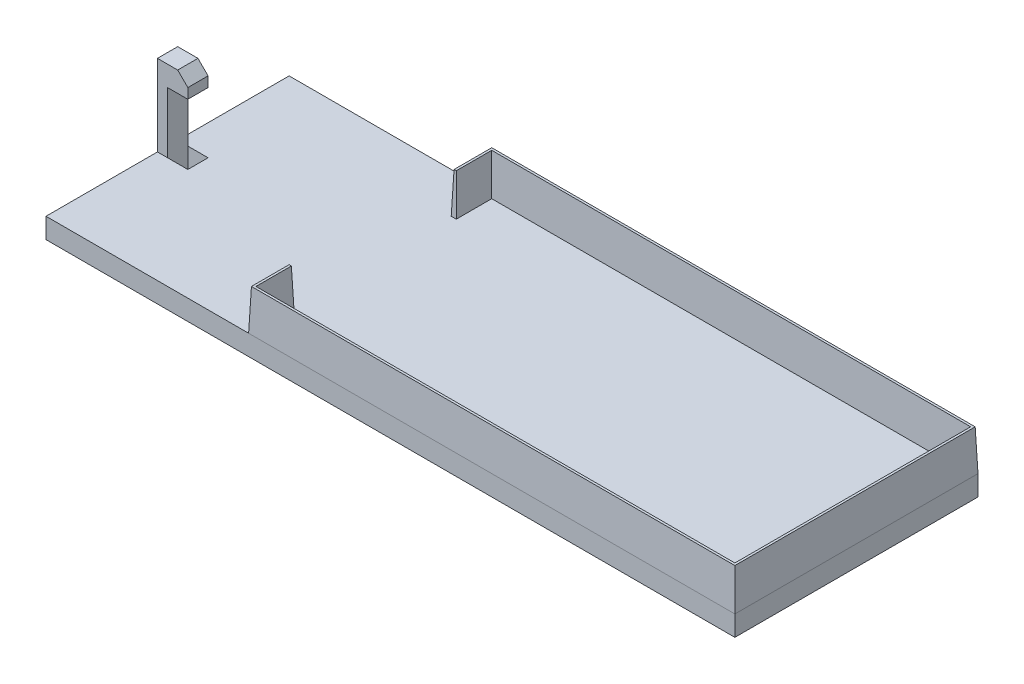
ISO-10303-21;
HEADER;
FILE_DESCRIPTION(('STEP AP214'),'2;1');
FILE_NAME('part.step','',(''),(''),'','','');
FILE_SCHEMA(('AUTOMOTIVE_DESIGN { 1 0 10303 214 1 1 1 1 }'));
ENDSEC;
DATA;
#1=APPLICATION_CONTEXT('core data for automotive mechanical design processes');
#2=APPLICATION_PROTOCOL_DEFINITION('international standard','automotive_design',2000,#1);
#3=PRODUCT_CONTEXT('',#1,'mechanical');
#4=PRODUCT('Part','Part','',(#3));
#5=PRODUCT_RELATED_PRODUCT_CATEGORY('part','',(#4));
#6=PRODUCT_DEFINITION_FORMATION('','',#4);
#7=PRODUCT_DEFINITION_CONTEXT('part definition',#1,'design');
#8=PRODUCT_DEFINITION('design','',#6,#7);
#9=PRODUCT_DEFINITION_SHAPE('','',#8);
#10=(LENGTH_UNIT() NAMED_UNIT(*) SI_UNIT(.MILLI.,.METRE.));
#11=(NAMED_UNIT(*) PLANE_ANGLE_UNIT() SI_UNIT($,.RADIAN.));
#12=(NAMED_UNIT(*) SI_UNIT($,.STERADIAN.) SOLID_ANGLE_UNIT());
#13=UNCERTAINTY_MEASURE_WITH_UNIT(LENGTH_MEASURE(1.E-05),#10,'distance_accuracy_value','');
#14=(GEOMETRIC_REPRESENTATION_CONTEXT(3) GLOBAL_UNCERTAINTY_ASSIGNED_CONTEXT((#13)) GLOBAL_UNIT_ASSIGNED_CONTEXT((#10,
#11,#12)) REPRESENTATION_CONTEXT('',''));
#15=CARTESIAN_POINT('',(0.,0.,0.));
#16=DIRECTION('',(0.,0.,1.));
#17=DIRECTION('',(1.,0.,0.));
#18=AXIS2_PLACEMENT_3D('',#15,#16,#17);
#19=CARTESIAN_POINT('',(0.,6.35,0.));
#20=DIRECTION('',(0.,-1.,0.));
#21=DIRECTION('',(0.,0.,-1.));
#22=AXIS2_PLACEMENT_3D('',#19,#20,#21);
#23=PLANE('',#22);
#24=DIRECTION('',(1.,0.,0.));
#25=VECTOR('',#24,1.);
#26=CARTESIAN_POINT('',(-104.775,6.35,-3.175));
#27=LINE('',#26,#25);
#28=CARTESIAN_POINT('',(-107.95,6.35,-3.17499999999998));
#29=VERTEX_POINT('',#28);
#30=CARTESIAN_POINT('',(-104.775,6.35,-3.175));
#31=VERTEX_POINT('',#30);
#32=EDGE_CURVE('E235',#29,#31,#27,.T.);
#33=ORIENTED_EDGE('',*,*,#32,.T.);
#34=DIRECTION('',(-1.,0.,0.));
#35=VECTOR('',#34,1.);
#36=CARTESIAN_POINT('',(-98.425,6.35,-3.175));
#37=LINE('',#36,#35);
#38=CARTESIAN_POINT('',(-98.425,6.35,-3.175));
#39=VERTEX_POINT('',#38);
#40=EDGE_CURVE('E56',#39,#31,#37,.T.);
#41=ORIENTED_EDGE('',*,*,#40,.F.);
#42=DIRECTION('',(0.,0.,-1.));
#43=VECTOR('',#42,1.);
#44=CARTESIAN_POINT('',(-98.425,6.35,3.175));
#45=LINE('',#44,#43);
#46=CARTESIAN_POINT('',(-98.425,6.35,3.175));
#47=VERTEX_POINT('',#46);
#48=EDGE_CURVE('E224',#47,#39,#45,.T.);
#49=ORIENTED_EDGE('',*,*,#48,.F.);
#50=DIRECTION('',(1.,0.,0.));
#51=VECTOR('',#50,1.);
#52=CARTESIAN_POINT('',(-104.775,6.35,3.175));
#53=LINE('',#52,#51);
#54=CARTESIAN_POINT('',(-104.775,6.35,3.175));
#55=VERTEX_POINT('',#54);
#56=EDGE_CURVE('E229',#55,#47,#53,.T.);
#57=ORIENTED_EDGE('',*,*,#56,.F.);
#58=DIRECTION('',(1.,0.,0.));
#59=VECTOR('',#58,1.);
#60=CARTESIAN_POINT('',(-104.775,6.35,3.175));
#61=LINE('',#60,#59);
#62=CARTESIAN_POINT('',(-107.95,6.35,3.175));
#63=VERTEX_POINT('',#62);
#64=EDGE_CURVE('E239',#63,#55,#61,.T.);
#65=ORIENTED_EDGE('',*,*,#64,.F.);
#66=DIRECTION('',(0.,0.,1.));
#67=VECTOR('',#66,1.);
#68=CARTESIAN_POINT('',(-107.95,6.35,38.1));
#69=LINE('',#68,#67);
#70=CARTESIAN_POINT('',(-107.95,6.35,38.1));
#71=VERTEX_POINT('',#70);
#72=EDGE_CURVE('E383',#63,#71,#69,.T.);
#73=ORIENTED_EDGE('',*,*,#72,.T.);
#74=DIRECTION('',(1.,0.,0.));
#75=VECTOR('',#74,1.);
#76=CARTESIAN_POINT('',(-107.95,6.35,38.1));
#77=LINE('',#76,#75);
#78=CARTESIAN_POINT('',(-44.45,6.35,38.1));
#79=VERTEX_POINT('',#78);
#80=EDGE_CURVE('E386',#71,#79,#77,.T.);
#81=ORIENTED_EDGE('',*,*,#80,.T.);
#82=DIRECTION('',(0.,0.,1.));
#83=VECTOR('',#82,1.);
#84=CARTESIAN_POINT('',(-44.45,6.35,25.4));
#85=LINE('',#84,#83);
#86=CARTESIAN_POINT('',(-44.45,6.35,25.4));
#87=VERTEX_POINT('',#86);
#88=EDGE_CURVE('E283',#87,#79,#85,.T.);
#89=ORIENTED_EDGE('',*,*,#88,.F.);
#90=DIRECTION('',(-1.,0.,0.));
#91=VECTOR('',#90,1.);
#92=CARTESIAN_POINT('',(-44.45,6.35,25.4));
#93=LINE('',#92,#91);
#94=CARTESIAN_POINT('',(-42.8625,6.35,25.4));
#95=VERTEX_POINT('',#94);
#96=EDGE_CURVE('E310',#95,#87,#93,.T.);
#97=ORIENTED_EDGE('',*,*,#96,.F.);
#98=DIRECTION('',(0.,0.,-1.));
#99=VECTOR('',#98,1.);
#100=CARTESIAN_POINT('',(-42.8625,6.35,25.4));
#101=LINE('',#100,#99);
#102=CARTESIAN_POINT('',(-42.8625,6.35,36.5125));
#103=VERTEX_POINT('',#102);
#104=EDGE_CURVE('E307',#103,#95,#101,.T.);
#105=ORIENTED_EDGE('',*,*,#104,.F.);
#106=DIRECTION('',(-1.,0.,0.));
#107=VECTOR('',#106,1.);
#108=CARTESIAN_POINT('',(-42.8625,6.35,36.5125));
#109=LINE('',#108,#107);
#110=CARTESIAN_POINT('',(106.3625,6.35,36.5125));
#111=VERTEX_POINT('',#110);
#112=EDGE_CURVE('E304',#111,#103,#109,.T.);
#113=ORIENTED_EDGE('',*,*,#112,.F.);
#114=DIRECTION('',(0.,0.,1.));
#115=VECTOR('',#114,1.);
#116=CARTESIAN_POINT('',(106.3625,6.35,36.5125));
#117=LINE('',#116,#115);
#118=CARTESIAN_POINT('',(106.3625,6.35,-36.5125));
#119=VERTEX_POINT('',#118);
#120=EDGE_CURVE('E301',#119,#111,#117,.T.);
#121=ORIENTED_EDGE('',*,*,#120,.F.);
#122=DIRECTION('',(1.,0.,0.));
#123=VECTOR('',#122,1.);
#124=CARTESIAN_POINT('',(106.3625,6.35,-36.5125));
#125=LINE('',#124,#123);
#126=CARTESIAN_POINT('',(-42.8625000000001,6.35,-36.5125));
#127=VERTEX_POINT('',#126);
#128=EDGE_CURVE('E298',#127,#119,#125,.T.);
#129=ORIENTED_EDGE('',*,*,#128,.F.);
#130=DIRECTION('',(0.,0.,-1.));
#131=VECTOR('',#130,1.);
#132=CARTESIAN_POINT('',(-42.8625000000001,6.35,-36.5125));
#133=LINE('',#132,#131);
#134=CARTESIAN_POINT('',(-42.8625000000001,6.35,-25.4));
#135=VERTEX_POINT('',#134);
#136=EDGE_CURVE('E295',#135,#127,#133,.T.);
#137=ORIENTED_EDGE('',*,*,#136,.F.);
#138=DIRECTION('',(1.,0.,0.));
#139=VECTOR('',#138,1.);
#140=CARTESIAN_POINT('',(-44.4500000000001,6.35,-25.4));
#141=LINE('',#140,#139);
#142=CARTESIAN_POINT('',(-44.4500000000001,6.35,-25.4));
#143=VERTEX_POINT('',#142);
#144=EDGE_CURVE('E292',#143,#135,#141,.T.);
#145=ORIENTED_EDGE('',*,*,#144,.F.);
#146=DIRECTION('',(0.,0.,1.));
#147=VECTOR('',#146,1.);
#148=CARTESIAN_POINT('',(-44.4500000000001,6.35,-38.1));
#149=LINE('',#148,#147);
#150=CARTESIAN_POINT('',(-44.4500000000001,6.35,-38.1));
#151=VERTEX_POINT('',#150);
#152=EDGE_CURVE('E289',#151,#143,#149,.T.);
#153=ORIENTED_EDGE('',*,*,#152,.F.);
#154=DIRECTION('',(-1.,0.,0.));
#155=VECTOR('',#154,1.);
#156=CARTESIAN_POINT('',(-107.95,6.35,-38.1));
#157=LINE('',#156,#155);
#158=CARTESIAN_POINT('',(-107.95,6.35,-38.1));
#159=VERTEX_POINT('',#158);
#160=EDGE_CURVE('E378',#151,#159,#157,.T.);
#161=ORIENTED_EDGE('',*,*,#160,.T.);
#162=EDGE_CURVE('E384',#159,#29,#69,.T.);
#163=ORIENTED_EDGE('',*,*,#162,.T.);
#164=EDGE_LOOP('',(#33,#41,#49,#57,#65,#73,#81,#89,#97,#105,#113,#121,#129,#137,#145,#153,#161,#163));
#165=FACE_BOUND('',#164,.T.);
#166=ADVANCED_FACE('F33',(#165),#23,.F.);
#167=CARTESIAN_POINT('',(107.95,6.35,38.1));
#168=DIRECTION('',(-1.,0.,0.));
#169=DIRECTION('',(0.,0.,1.));
#170=AXIS2_PLACEMENT_3D('',#167,#168,#169);
#171=PLANE('',#170);
#172=DIRECTION('',(0.,0.,-1.));
#173=VECTOR('',#172,1.);
#174=CARTESIAN_POINT('',(107.95,0.,38.1));
#175=LINE('',#174,#173);
#176=CARTESIAN_POINT('',(107.95,0.,38.1));
#177=VERTEX_POINT('',#176);
#178=CARTESIAN_POINT('',(107.95,0.,-38.1));
#179=VERTEX_POINT('',#178);
#180=EDGE_CURVE('E317',#177,#179,#175,.T.);
#181=ORIENTED_EDGE('',*,*,#180,.T.);
#182=DIRECTION('',(0.,-1.,0.));
#183=VECTOR('',#182,1.);
#184=CARTESIAN_POINT('',(107.95,6.35,-38.1));
#185=LINE('',#184,#183);
#186=CARTESIAN_POINT('',(107.95,6.35,-38.1));
#187=VERTEX_POINT('',#186);
#188=EDGE_CURVE('E11',#187,#179,#185,.T.);
#189=ORIENTED_EDGE('',*,*,#188,.F.);
#190=DIRECTION('',(0.,0.,-1.));
#191=VECTOR('',#190,1.);
#192=CARTESIAN_POINT('',(107.95,6.35,38.1));
#193=LINE('',#192,#191);
#194=CARTESIAN_POINT('',(107.95,6.35,38.1));
#195=VERTEX_POINT('',#194);
#196=EDGE_CURVE('E375',#195,#187,#193,.T.);
#197=ORIENTED_EDGE('',*,*,#196,.F.);
#198=DIRECTION('',(0.,-1.,0.));
#199=VECTOR('',#198,1.);
#200=CARTESIAN_POINT('',(107.95,6.35,38.1));
#201=LINE('',#200,#199);
#202=EDGE_CURVE('E389',#195,#177,#201,.T.);
#203=ORIENTED_EDGE('',*,*,#202,.T.);
#204=EDGE_LOOP('',(#181,#189,#197,#203));
#205=FACE_BOUND('',#204,.T.);
#206=ADVANCED_FACE('F35',(#205),#171,.F.);
#207=CARTESIAN_POINT('',(-107.95,6.35,-38.1));
#208=DIRECTION('',(0.,0.,1.));
#209=DIRECTION('',(1.,0.,0.));
#210=AXIS2_PLACEMENT_3D('',#207,#208,#209);
#211=PLANE('',#210);
#212=DIRECTION('',(-1.,0.,0.));
#213=VECTOR('',#212,1.);
#214=CARTESIAN_POINT('',(-107.95,0.,-38.1));
#215=LINE('',#214,#213);
#216=CARTESIAN_POINT('',(-107.95,0.,-38.1));
#217=VERTEX_POINT('',#216);
#218=EDGE_CURVE('E392',#179,#217,#215,.T.);
#219=ORIENTED_EDGE('',*,*,#218,.T.);
#220=DIRECTION('',(0.,-1.,0.));
#221=VECTOR('',#220,1.);
#222=CARTESIAN_POINT('',(-107.95,6.35,-38.1));
#223=LINE('',#222,#221);
#224=EDGE_CURVE('E41',#159,#217,#223,.T.);
#225=ORIENTED_EDGE('',*,*,#224,.F.);
#226=ORIENTED_EDGE('',*,*,#160,.F.);
#227=EDGE_CURVE('E380',#187,#151,#157,.T.);
#228=ORIENTED_EDGE('',*,*,#227,.F.);
#229=ORIENTED_EDGE('',*,*,#188,.T.);
#230=EDGE_LOOP('',(#219,#225,#226,#228,#229));
#231=FACE_BOUND('',#230,.T.);
#232=ADVANCED_FACE('F466',(#231),#211,.F.);
#233=CARTESIAN_POINT('',(-107.95,6.35,38.1));
#234=DIRECTION('',(1.,0.,0.));
#235=DIRECTION('',(0.,0.,-1.));
#236=AXIS2_PLACEMENT_3D('',#233,#234,#235);
#237=PLANE('',#236);
#238=DIRECTION('',(0.,0.,1.));
#239=VECTOR('',#238,1.);
#240=CARTESIAN_POINT('',(-107.95,0.,38.1));
#241=LINE('',#240,#239);
#242=CARTESIAN_POINT('',(-107.95,0.,38.1));
#243=VERTEX_POINT('',#242);
#244=EDGE_CURVE('E394',#217,#243,#241,.T.);
#245=ORIENTED_EDGE('',*,*,#244,.T.);
#246=DIRECTION('',(0.,-1.,0.));
#247=VECTOR('',#246,1.);
#248=CARTESIAN_POINT('',(-107.95,6.35,38.1));
#249=LINE('',#248,#247);
#250=EDGE_CURVE('E399',#71,#243,#249,.T.);
#251=ORIENTED_EDGE('',*,*,#250,.F.);
#252=ORIENTED_EDGE('',*,*,#72,.F.);
#253=DIRECTION('',(0.,-1.,0.));
#254=VECTOR('',#253,1.);
#255=CARTESIAN_POINT('',(-107.95,6.35,3.175));
#256=LINE('',#255,#254);
#257=CARTESIAN_POINT('',(-107.95,31.75,3.175));
#258=VERTEX_POINT('',#257);
#259=EDGE_CURVE('E251',#258,#63,#256,.T.);
#260=ORIENTED_EDGE('',*,*,#259,.F.);
#261=DIRECTION('',(0.,0.,-1.));
#262=VECTOR('',#261,1.);
#263=CARTESIAN_POINT('',(-107.95,31.75,3.175));
#264=LINE('',#263,#262);
#265=CARTESIAN_POINT('',(-107.95,31.75,-3.175));
#266=VERTEX_POINT('',#265);
#267=EDGE_CURVE('E254',#258,#266,#264,.T.);
#268=ORIENTED_EDGE('',*,*,#267,.T.);
#269=DIRECTION('',(0.,-1.,0.));
#270=VECTOR('',#269,1.);
#271=CARTESIAN_POINT('',(-107.95,6.35,-3.175));
#272=LINE('',#271,#270);
#273=EDGE_CURVE('E241',#266,#29,#272,.T.);
#274=ORIENTED_EDGE('',*,*,#273,.T.);
#275=ORIENTED_EDGE('',*,*,#162,.F.);
#276=ORIENTED_EDGE('',*,*,#224,.T.);
#277=EDGE_LOOP('',(#245,#251,#252,#260,#268,#274,#275,#276));
#278=FACE_BOUND('',#277,.T.);
#279=ADVANCED_FACE('F406',(#278),#237,.F.);
#280=CARTESIAN_POINT('',(-107.95,6.35,38.1));
#281=DIRECTION('',(0.,0.,-1.));
#282=DIRECTION('',(-1.,0.,0.));
#283=AXIS2_PLACEMENT_3D('',#280,#281,#282);
#284=PLANE('',#283);
#285=DIRECTION('',(1.,0.,0.));
#286=VECTOR('',#285,1.);
#287=CARTESIAN_POINT('',(-107.95,0.,38.1));
#288=LINE('',#287,#286);
#289=EDGE_CURVE('E379',#243,#177,#288,.T.);
#290=ORIENTED_EDGE('',*,*,#289,.T.);
#291=ORIENTED_EDGE('',*,*,#202,.F.);
#292=DIRECTION('',(1.,0.,0.));
#293=VECTOR('',#292,1.);
#294=CARTESIAN_POINT('',(-44.45,6.35,38.1));
#295=LINE('',#294,#293);
#296=EDGE_CURVE('E286',#79,#195,#295,.T.);
#297=ORIENTED_EDGE('',*,*,#296,.F.);
#298=ORIENTED_EDGE('',*,*,#80,.F.);
#299=ORIENTED_EDGE('',*,*,#250,.T.);
#300=EDGE_LOOP('',(#290,#291,#297,#298,#299));
#301=FACE_BOUND('',#300,.T.);
#302=ADVANCED_FACE('F413',(#301),#284,.F.);
#303=CARTESIAN_POINT('',(0.,0.,0.));
#304=DIRECTION('',(0.,-1.,0.));
#305=DIRECTION('',(0.,0.,-1.));
#306=AXIS2_PLACEMENT_3D('',#303,#304,#305);
#307=PLANE('',#306);
#308=DIRECTION('',(0.,0.,1.));
#309=VECTOR('',#308,1.);
#310=CARTESIAN_POINT('',(-104.775,0.,-3.175));
#311=LINE('',#310,#309);
#312=CARTESIAN_POINT('',(-104.775,0.,-3.175));
#313=VERTEX_POINT('',#312);
#314=CARTESIAN_POINT('',(-104.775,0.,3.175));
#315=VERTEX_POINT('',#314);
#316=EDGE_CURVE('E204',#313,#315,#311,.T.);
#317=ORIENTED_EDGE('',*,*,#316,.T.);
#318=DIRECTION('',(1.,0.,0.));
#319=VECTOR('',#318,1.);
#320=CARTESIAN_POINT('',(-104.775,0.,3.175));
#321=LINE('',#320,#319);
#322=CARTESIAN_POINT('',(-98.425,0.,3.175));
#323=VERTEX_POINT('',#322);
#324=EDGE_CURVE('E216',#315,#323,#321,.T.);
#325=ORIENTED_EDGE('',*,*,#324,.T.);
#326=DIRECTION('',(0.,0.,-1.));
#327=VECTOR('',#326,1.);
#328=CARTESIAN_POINT('',(-98.425,0.,3.175));
#329=LINE('',#328,#327);
#330=CARTESIAN_POINT('',(-98.425,0.,-3.175));
#331=VERTEX_POINT('',#330);
#332=EDGE_CURVE('E48',#323,#331,#329,.T.);
#333=ORIENTED_EDGE('',*,*,#332,.T.);
#334=DIRECTION('',(-1.,0.,0.));
#335=VECTOR('',#334,1.);
#336=CARTESIAN_POINT('',(-98.425,0.,-3.175));
#337=LINE('',#336,#335);
#338=EDGE_CURVE('E213',#331,#313,#337,.T.);
#339=ORIENTED_EDGE('',*,*,#338,.T.);
#340=EDGE_LOOP('',(#317,#325,#333,#339));
#341=FACE_BOUND('',#340,.T.);
#342=ORIENTED_EDGE('',*,*,#180,.F.);
#343=ORIENTED_EDGE('',*,*,#289,.F.);
#344=ORIENTED_EDGE('',*,*,#244,.F.);
#345=ORIENTED_EDGE('',*,*,#218,.F.);
#346=EDGE_LOOP('',(#342,#343,#344,#345));
#347=FACE_BOUND('',#346,.T.);
#348=ADVANCED_FACE('F220',(#341,#347),#307,.T.);
#349=CARTESIAN_POINT('',(-44.45,6.35,25.4));
#350=DIRECTION('',(-0.999390827019096,0.034899496702501,0.));
#351=DIRECTION('',(-0.034899496702501,-0.999390827019096,0.));
#352=AXIS2_PLACEMENT_3D('',#349,#350,#351);
#353=PLANE('',#352);
#354=ORIENTED_EDGE('',*,*,#88,.T.);
#355=DIRECTION('',(-0.0348782627423747,-0.998782765958718,0.0348782627423747));
#356=VECTOR('',#355,1.);
#357=CARTESIAN_POINT('',(-44.45,6.35,38.1));
#358=LINE('',#357,#356);
#359=CARTESIAN_POINT('',(-44.0065062274548,19.05,37.6565062274548));
#360=VERTEX_POINT('',#359);
#361=EDGE_CURVE('E314',#360,#79,#358,.T.);
#362=ORIENTED_EDGE('',*,*,#361,.F.);
#363=DIRECTION('',(0.,0.,-1.));
#364=VECTOR('',#363,1.);
#365=CARTESIAN_POINT('',(-44.0065062274548,19.05,25.4));
#366=LINE('',#365,#364);
#367=CARTESIAN_POINT('',(-44.0065062274548,19.05,25.8434937725452));
#368=VERTEX_POINT('',#367);
#369=EDGE_CURVE('E313',#368,#360,#366,.F.);
#370=ORIENTED_EDGE('',*,*,#369,.F.);
#371=DIRECTION('',(-0.0348782627423747,-0.998782765958718,-0.0348782627423747));
#372=VECTOR('',#371,1.);
#373=CARTESIAN_POINT('',(-44.45,6.35,25.4));
#374=LINE('',#373,#372);
#375=EDGE_CURVE('E319',#368,#87,#374,.T.);
#376=ORIENTED_EDGE('',*,*,#375,.T.);
#377=EDGE_LOOP('',(#354,#362,#370,#376));
#378=FACE_BOUND('',#377,.T.);
#379=ADVANCED_FACE('F434',(#378),#353,.T.);
#380=CARTESIAN_POINT('',(-44.45,6.35,38.1));
#381=DIRECTION('',(0.,0.034899496702501,0.999390827019096));
#382=DIRECTION('',(0.,-0.999390827019096,0.034899496702501));
#383=AXIS2_PLACEMENT_3D('',#380,#381,#382);
#384=PLANE('',#383);
#385=ORIENTED_EDGE('',*,*,#296,.T.);
#386=DIRECTION('',(0.0348782627423747,-0.998782765958718,0.0348782627423747));
#387=VECTOR('',#386,1.);
#388=CARTESIAN_POINT('',(107.95,6.35,38.1));
#389=LINE('',#388,#387);
#390=CARTESIAN_POINT('',(107.506506227455,19.05,37.6565062274548));
#391=VERTEX_POINT('',#390);
#392=EDGE_CURVE('E318',#391,#195,#389,.T.);
#393=ORIENTED_EDGE('',*,*,#392,.F.);
#394=DIRECTION('',(-1.,0.,0.));
#395=VECTOR('',#394,1.);
#396=CARTESIAN_POINT('',(-44.45,19.05,37.6565062274548));
#397=LINE('',#396,#395);
#398=EDGE_CURVE('E354',#360,#391,#397,.F.);
#399=ORIENTED_EDGE('',*,*,#398,.F.);
#400=ORIENTED_EDGE('',*,*,#361,.T.);
#401=EDGE_LOOP('',(#385,#393,#399,#400));
#402=FACE_BOUND('',#401,.T.);
#403=ADVANCED_FACE('F422',(#402),#384,.T.);
#404=CARTESIAN_POINT('',(107.95,6.35,38.1));
#405=DIRECTION('',(0.999390827019096,0.034899496702501,0.));
#406=DIRECTION('',(-0.034899496702501,0.999390827019096,0.));
#407=AXIS2_PLACEMENT_3D('',#404,#405,#406);
#408=PLANE('',#407);
#409=ORIENTED_EDGE('',*,*,#196,.T.);
#410=DIRECTION('',(0.0348782627423747,-0.998782765958718,-0.0348782627423747));
#411=VECTOR('',#410,1.);
#412=CARTESIAN_POINT('',(107.95,6.35,-38.1));
#413=LINE('',#412,#411);
#414=CARTESIAN_POINT('',(107.506506227455,19.05,-37.6565062274548));
#415=VERTEX_POINT('',#414);
#416=EDGE_CURVE('E347',#415,#187,#413,.T.);
#417=ORIENTED_EDGE('',*,*,#416,.F.);
#418=DIRECTION('',(0.,0.,1.));
#419=VECTOR('',#418,1.);
#420=CARTESIAN_POINT('',(107.506506227455,19.05,38.1));
#421=LINE('',#420,#419);
#422=EDGE_CURVE('E356',#391,#415,#421,.F.);
#423=ORIENTED_EDGE('',*,*,#422,.F.);
#424=ORIENTED_EDGE('',*,*,#392,.T.);
#425=EDGE_LOOP('',(#409,#417,#423,#424));
#426=FACE_BOUND('',#425,.T.);
#427=ADVANCED_FACE('F425',(#426),#408,.T.);
#428=CARTESIAN_POINT('',(107.95,6.35,-38.1));
#429=DIRECTION('',(0.,0.034899496702501,-0.999390827019096));
#430=DIRECTION('',(0.,0.999390827019096,0.034899496702501));
#431=AXIS2_PLACEMENT_3D('',#428,#429,#430);
#432=PLANE('',#431);
#433=ORIENTED_EDGE('',*,*,#227,.T.);
#434=DIRECTION('',(-0.0348782627423746,-0.998782765958718,-0.0348782627423747));
#435=VECTOR('',#434,1.);
#436=CARTESIAN_POINT('',(-44.4500000000001,6.35,-38.1));
#437=LINE('',#436,#435);
#438=CARTESIAN_POINT('',(-44.0065062274549,19.05,-37.6565062274548));
#439=VERTEX_POINT('',#438);
#440=EDGE_CURVE('E344',#439,#151,#437,.T.);
#441=ORIENTED_EDGE('',*,*,#440,.F.);
#442=DIRECTION('',(1.,0.,0.));
#443=VECTOR('',#442,1.);
#444=CARTESIAN_POINT('',(107.95,19.05,-37.6565062274548));
#445=LINE('',#444,#443);
#446=EDGE_CURVE('E358',#415,#439,#445,.F.);
#447=ORIENTED_EDGE('',*,*,#446,.F.);
#448=ORIENTED_EDGE('',*,*,#416,.T.);
#449=EDGE_LOOP('',(#433,#441,#447,#448));
#450=FACE_BOUND('',#449,.T.);
#451=ADVANCED_FACE('F468',(#450),#432,.T.);
#452=CARTESIAN_POINT('',(-44.4500000000001,6.35,-38.1));
#453=DIRECTION('',(-0.999390827019096,0.034899496702501,0.));
#454=DIRECTION('',(-0.034899496702501,-0.999390827019096,0.));
#455=AXIS2_PLACEMENT_3D('',#452,#453,#454);
#456=PLANE('',#455);
#457=ORIENTED_EDGE('',*,*,#152,.T.);
#458=DIRECTION('',(-0.0348782627423747,-0.998782765958718,0.0348782627423747));
#459=VECTOR('',#458,1.);
#460=CARTESIAN_POINT('',(-44.4500000000001,6.35,-25.4));
#461=LINE('',#460,#459);
#462=CARTESIAN_POINT('',(-44.0065062274549,19.05,-25.8434937725452));
#463=VERTEX_POINT('',#462);
#464=EDGE_CURVE('E341',#463,#143,#461,.T.);
#465=ORIENTED_EDGE('',*,*,#464,.F.);
#466=DIRECTION('',(0.,0.,-1.));
#467=VECTOR('',#466,1.);
#468=CARTESIAN_POINT('',(-44.0065062274549,19.05,-38.1));
#469=LINE('',#468,#467);
#470=EDGE_CURVE('E360',#439,#463,#469,.F.);
#471=ORIENTED_EDGE('',*,*,#470,.F.);
#472=ORIENTED_EDGE('',*,*,#440,.T.);
#473=EDGE_LOOP('',(#457,#465,#471,#472));
#474=FACE_BOUND('',#473,.T.);
#475=ADVANCED_FACE('F465',(#474),#456,.T.);
#476=CARTESIAN_POINT('',(-44.4500000000001,6.35,-25.4));
#477=DIRECTION('',(0.,0.034899496702501,0.999390827019096));
#478=DIRECTION('',(0.,-0.999390827019096,0.034899496702501));
#479=AXIS2_PLACEMENT_3D('',#476,#477,#478);
#480=PLANE('',#479);
#481=ORIENTED_EDGE('',*,*,#144,.T.);
#482=DIRECTION('',(0.0348782627423747,-0.998782765958718,0.0348782627423747));
#483=VECTOR('',#482,1.);
#484=CARTESIAN_POINT('',(-42.8760182808176,6.73711291344034,-25.4135182808175));
#485=LINE('',#484,#483);
#486=CARTESIAN_POINT('',(-43.3059937725452,19.05,-25.8434937725452));
#487=VERTEX_POINT('',#486);
#488=EDGE_CURVE('E338',#487,#135,#485,.T.);
#489=ORIENTED_EDGE('',*,*,#488,.F.);
#490=DIRECTION('',(-1.,0.,0.));
#491=VECTOR('',#490,1.);
#492=CARTESIAN_POINT('',(-44.4500000000001,19.05,-25.8434937725452));
#493=LINE('',#492,#491);
#494=EDGE_CURVE('E362',#463,#487,#493,.F.);
#495=ORIENTED_EDGE('',*,*,#494,.F.);
#496=ORIENTED_EDGE('',*,*,#464,.T.);
#497=EDGE_LOOP('',(#481,#489,#495,#496));
#498=FACE_BOUND('',#497,.T.);
#499=ADVANCED_FACE('F460',(#498),#480,.T.);
#500=CARTESIAN_POINT('',(-42.8625000000001,6.35,-36.5125));
#501=DIRECTION('',(0.999390827019096,0.034899496702501,0.));
#502=DIRECTION('',(-0.034899496702501,0.999390827019096,0.));
#503=AXIS2_PLACEMENT_3D('',#500,#501,#502);
#504=PLANE('',#503);
#505=ORIENTED_EDGE('',*,*,#136,.T.);
#506=DIRECTION('',(0.0348782627423747,-0.998782765958718,0.0348782627423747));
#507=VECTOR('',#506,1.);
#508=CARTESIAN_POINT('',(-42.8625000000001,6.35,-36.5125));
#509=LINE('',#508,#507);
#510=CARTESIAN_POINT('',(-43.3059937725452,19.05,-36.9559937725452));
#511=VERTEX_POINT('',#510);
#512=EDGE_CURVE('E335',#511,#127,#509,.T.);
#513=ORIENTED_EDGE('',*,*,#512,.F.);
#514=DIRECTION('',(0.,0.,1.));
#515=VECTOR('',#514,1.);
#516=CARTESIAN_POINT('',(-43.3059937725452,19.05,-36.5125));
#517=LINE('',#516,#515);
#518=EDGE_CURVE('E364',#487,#511,#517,.F.);
#519=ORIENTED_EDGE('',*,*,#518,.F.);
#520=ORIENTED_EDGE('',*,*,#488,.T.);
#521=EDGE_LOOP('',(#505,#513,#519,#520));
#522=FACE_BOUND('',#521,.T.);
#523=ADVANCED_FACE('F457',(#522),#504,.T.);
#524=CARTESIAN_POINT('',(106.3625,6.35,-36.5125));
#525=DIRECTION('',(0.,0.034899496702501,0.999390827019096));
#526=DIRECTION('',(0.,-0.999390827019096,0.034899496702501));
#527=AXIS2_PLACEMENT_3D('',#524,#525,#526);
#528=PLANE('',#527);
#529=ORIENTED_EDGE('',*,*,#128,.T.);
#530=DIRECTION('',(-0.0348782627423747,-0.998782765958718,0.0348782627423747));
#531=VECTOR('',#530,1.);
#532=CARTESIAN_POINT('',(106.3625,6.35,-36.5125));
#533=LINE('',#532,#531);
#534=CARTESIAN_POINT('',(106.805993772545,19.05,-36.9559937725452));
#535=VERTEX_POINT('',#534);
#536=EDGE_CURVE('E332',#535,#119,#533,.T.);
#537=ORIENTED_EDGE('',*,*,#536,.F.);
#538=DIRECTION('',(-1.,0.,0.));
#539=VECTOR('',#538,1.);
#540=CARTESIAN_POINT('',(106.3625,19.05,-36.9559937725452));
#541=LINE('',#540,#539);
#542=EDGE_CURVE('E366',#511,#535,#541,.F.);
#543=ORIENTED_EDGE('',*,*,#542,.F.);
#544=ORIENTED_EDGE('',*,*,#512,.T.);
#545=EDGE_LOOP('',(#529,#537,#543,#544));
#546=FACE_BOUND('',#545,.T.);
#547=ADVANCED_FACE('F452',(#546),#528,.T.);
#548=CARTESIAN_POINT('',(106.3625,6.35,36.5125));
#549=DIRECTION('',(-0.999390827019096,0.034899496702501,0.));
#550=DIRECTION('',(-0.034899496702501,-0.999390827019096,0.));
#551=AXIS2_PLACEMENT_3D('',#548,#549,#550);
#552=PLANE('',#551);
#553=ORIENTED_EDGE('',*,*,#120,.T.);
#554=DIRECTION('',(-0.0348782627423747,-0.998782765958718,-0.0348782627423747));
#555=VECTOR('',#554,1.);
#556=CARTESIAN_POINT('',(106.3625,6.35,36.5125));
#557=LINE('',#556,#555);
#558=CARTESIAN_POINT('',(106.805993772545,19.05,36.9559937725452));
#559=VERTEX_POINT('',#558);
#560=EDGE_CURVE('E329',#559,#111,#557,.T.);
#561=ORIENTED_EDGE('',*,*,#560,.F.);
#562=DIRECTION('',(0.,0.,-1.));
#563=VECTOR('',#562,1.);
#564=CARTESIAN_POINT('',(106.805993772545,19.05,36.5125));
#565=LINE('',#564,#563);
#566=EDGE_CURVE('E368',#535,#559,#565,.F.);
#567=ORIENTED_EDGE('',*,*,#566,.F.);
#568=ORIENTED_EDGE('',*,*,#536,.T.);
#569=EDGE_LOOP('',(#553,#561,#567,#568));
#570=FACE_BOUND('',#569,.T.);
#571=ADVANCED_FACE('F449',(#570),#552,.T.);
#572=CARTESIAN_POINT('',(-42.8625,6.35,36.5125));
#573=DIRECTION('',(0.,0.034899496702501,-0.999390827019096));
#574=DIRECTION('',(0.,0.999390827019096,0.034899496702501));
#575=AXIS2_PLACEMENT_3D('',#572,#573,#574);
#576=PLANE('',#575);
#577=ORIENTED_EDGE('',*,*,#112,.T.);
#578=DIRECTION('',(0.0348782627423747,-0.998782765958718,-0.0348782627423747));
#579=VECTOR('',#578,1.);
#580=CARTESIAN_POINT('',(-42.8625,6.35,36.5125));
#581=LINE('',#580,#579);
#582=CARTESIAN_POINT('',(-43.3059937725452,19.05,36.9559937725452));
#583=VERTEX_POINT('',#582);
#584=EDGE_CURVE('E326',#583,#103,#581,.T.);
#585=ORIENTED_EDGE('',*,*,#584,.F.);
#586=DIRECTION('',(1.,0.,0.));
#587=VECTOR('',#586,1.);
#588=CARTESIAN_POINT('',(-42.8625,19.05,36.9559937725452));
#589=LINE('',#588,#587);
#590=EDGE_CURVE('E370',#559,#583,#589,.F.);
#591=ORIENTED_EDGE('',*,*,#590,.F.);
#592=ORIENTED_EDGE('',*,*,#560,.T.);
#593=EDGE_LOOP('',(#577,#585,#591,#592));
#594=FACE_BOUND('',#593,.T.);
#595=ADVANCED_FACE('F444',(#594),#576,.T.);
#596=CARTESIAN_POINT('',(-42.8625,6.35,25.4));
#597=DIRECTION('',(0.999390827019096,0.034899496702501,0.));
#598=DIRECTION('',(-0.034899496702501,0.999390827019096,0.));
#599=AXIS2_PLACEMENT_3D('',#596,#597,#598);
#600=PLANE('',#599);
#601=ORIENTED_EDGE('',*,*,#104,.T.);
#602=DIRECTION('',(0.0348782627423747,-0.998782765958718,-0.0348782627423747));
#603=VECTOR('',#602,1.);
#604=CARTESIAN_POINT('',(-42.864431182974,6.40530184477719,25.4019311829739));
#605=LINE('',#604,#603);
#606=CARTESIAN_POINT('',(-43.3059937725452,19.05,25.8434937725452));
#607=VERTEX_POINT('',#606);
#608=EDGE_CURVE('E322',#607,#95,#605,.T.);
#609=ORIENTED_EDGE('',*,*,#608,.F.);
#610=DIRECTION('',(0.,0.,1.));
#611=VECTOR('',#610,1.);
#612=CARTESIAN_POINT('',(-43.3059937725452,19.05,25.4));
#613=LINE('',#612,#611);
#614=EDGE_CURVE('E372',#583,#607,#613,.F.);
#615=ORIENTED_EDGE('',*,*,#614,.F.);
#616=ORIENTED_EDGE('',*,*,#584,.T.);
#617=EDGE_LOOP('',(#601,#609,#615,#616));
#618=FACE_BOUND('',#617,.T.);
#619=ADVANCED_FACE('F441',(#618),#600,.T.);
#620=CARTESIAN_POINT('',(-44.45,6.35,25.4));
#621=DIRECTION('',(0.,0.034899496702501,-0.999390827019096));
#622=DIRECTION('',(0.,0.999390827019096,0.034899496702501));
#623=AXIS2_PLACEMENT_3D('',#620,#621,#622);
#624=PLANE('',#623);
#625=ORIENTED_EDGE('',*,*,#96,.T.);
#626=ORIENTED_EDGE('',*,*,#375,.F.);
#627=DIRECTION('',(1.,0.,0.));
#628=VECTOR('',#627,1.);
#629=CARTESIAN_POINT('',(-44.45,19.05,25.8434937725452));
#630=LINE('',#629,#628);
#631=EDGE_CURVE('E323',#607,#368,#630,.F.);
#632=ORIENTED_EDGE('',*,*,#631,.F.);
#633=ORIENTED_EDGE('',*,*,#608,.T.);
#634=EDGE_LOOP('',(#625,#626,#632,#633));
#635=FACE_BOUND('',#634,.T.);
#636=ADVANCED_FACE('F437',(#635),#624,.T.);
#637=CARTESIAN_POINT('',(0.,19.05,0.));
#638=DIRECTION('',(0.,1.,0.));
#639=DIRECTION('',(0.,0.,1.));
#640=AXIS2_PLACEMENT_3D('',#637,#638,#639);
#641=PLANE('',#640);
#642=ORIENTED_EDGE('',*,*,#369,.T.);
#643=ORIENTED_EDGE('',*,*,#398,.T.);
#644=ORIENTED_EDGE('',*,*,#422,.T.);
#645=ORIENTED_EDGE('',*,*,#446,.T.);
#646=ORIENTED_EDGE('',*,*,#470,.T.);
#647=ORIENTED_EDGE('',*,*,#494,.T.);
#648=ORIENTED_EDGE('',*,*,#518,.T.);
#649=ORIENTED_EDGE('',*,*,#542,.T.);
#650=ORIENTED_EDGE('',*,*,#566,.T.);
#651=ORIENTED_EDGE('',*,*,#590,.T.);
#652=ORIENTED_EDGE('',*,*,#614,.T.);
#653=ORIENTED_EDGE('',*,*,#631,.T.);
#654=EDGE_LOOP('',(#642,#643,#644,#645,#646,#647,#648,#649,#650,#651,#652,#653));
#655=FACE_BOUND('',#654,.T.);
#656=ADVANCED_FACE('F428',(#655),#641,.T.);
#657=CARTESIAN_POINT('',(-104.775,25.4,3.175));
#658=DIRECTION('',(-1.,0.,0.));
#659=DIRECTION('',(0.,0.,1.));
#660=AXIS2_PLACEMENT_3D('',#657,#658,#659);
#661=PLANE('',#660);
#662=DIRECTION('',(0.,1.,0.));
#663=VECTOR('',#662,1.);
#664=CARTESIAN_POINT('',(-104.775,25.4,-3.175));
#665=LINE('',#664,#663);
#666=CARTESIAN_POINT('',(-104.775,25.4,-3.175));
#667=VERTEX_POINT('',#666);
#668=EDGE_CURVE('E257',#31,#667,#665,.T.);
#669=ORIENTED_EDGE('',*,*,#668,.T.);
#670=DIRECTION('',(0.,0.,-1.));
#671=VECTOR('',#670,1.);
#672=CARTESIAN_POINT('',(-104.775,25.4,3.175));
#673=LINE('',#672,#671);
#674=CARTESIAN_POINT('',(-104.775,25.4,3.175));
#675=VERTEX_POINT('',#674);
#676=EDGE_CURVE('E280',#675,#667,#673,.T.);
#677=ORIENTED_EDGE('',*,*,#676,.F.);
#678=DIRECTION('',(0.,1.,0.));
#679=VECTOR('',#678,1.);
#680=CARTESIAN_POINT('',(-104.775,25.4,3.175));
#681=LINE('',#680,#679);
#682=EDGE_CURVE('E207',#55,#675,#681,.T.);
#683=ORIENTED_EDGE('',*,*,#682,.F.);
#684=DIRECTION('',(0.,1.,0.));
#685=VECTOR('',#684,1.);
#686=CARTESIAN_POINT('',(-104.775,0.,3.175));
#687=LINE('',#686,#685);
#688=EDGE_CURVE('E200',#315,#55,#687,.T.);
#689=ORIENTED_EDGE('',*,*,#688,.F.);
#690=ORIENTED_EDGE('',*,*,#316,.F.);
#691=DIRECTION('',(0.,1.,0.));
#692=VECTOR('',#691,1.);
#693=CARTESIAN_POINT('',(-104.775,0.,-3.175));
#694=LINE('',#693,#692);
#695=EDGE_CURVE('E233',#313,#31,#694,.T.);
#696=ORIENTED_EDGE('',*,*,#695,.T.);
#697=EDGE_LOOP('',(#669,#677,#683,#689,#690,#696));
#698=FACE_BOUND('',#697,.T.);
#699=ADVANCED_FACE('F202',(#698),#661,.F.);
#700=CARTESIAN_POINT('',(-98.425,25.4,3.175));
#701=DIRECTION('',(0.,1.,0.));
#702=DIRECTION('',(-1.,0.,0.));
#703=AXIS2_PLACEMENT_3D('',#700,#701,#702);
#704=PLANE('',#703);
#705=DIRECTION('',(1.,0.,0.));
#706=VECTOR('',#705,1.);
#707=CARTESIAN_POINT('',(-98.425,25.4,-3.175));
#708=LINE('',#707,#706);
#709=CARTESIAN_POINT('',(-98.425,25.4,-3.175));
#710=VERTEX_POINT('',#709);
#711=EDGE_CURVE('E259',#667,#710,#708,.T.);
#712=ORIENTED_EDGE('',*,*,#711,.T.);
#713=DIRECTION('',(0.,0.,-1.));
#714=VECTOR('',#713,1.);
#715=CARTESIAN_POINT('',(-98.425,25.4,3.175));
#716=LINE('',#715,#714);
#717=CARTESIAN_POINT('',(-98.425,25.4,3.175));
#718=VERTEX_POINT('',#717);
#719=EDGE_CURVE('E277',#718,#710,#716,.T.);
#720=ORIENTED_EDGE('',*,*,#719,.F.);
#721=DIRECTION('',(1.,0.,0.));
#722=VECTOR('',#721,1.);
#723=CARTESIAN_POINT('',(-98.425,25.4,3.175));
#724=LINE('',#723,#722);
#725=EDGE_CURVE('E243',#675,#718,#724,.T.);
#726=ORIENTED_EDGE('',*,*,#725,.F.);
#727=ORIENTED_EDGE('',*,*,#676,.T.);
#728=EDGE_LOOP('',(#712,#720,#726,#727));
#729=FACE_BOUND('',#728,.T.);
#730=ADVANCED_FACE('F605',(#729),#704,.F.);
#731=CARTESIAN_POINT('',(-98.425,28.575,3.175));
#732=DIRECTION('',(-1.,0.,0.));
#733=DIRECTION('',(0.,0.,1.));
#734=AXIS2_PLACEMENT_3D('',#731,#732,#733);
#735=PLANE('',#734);
#736=DIRECTION('',(0.,1.,0.));
#737=VECTOR('',#736,1.);
#738=CARTESIAN_POINT('',(-98.425,28.575,-3.175));
#739=LINE('',#738,#737);
#740=CARTESIAN_POINT('',(-98.425,28.575,-3.175));
#741=VERTEX_POINT('',#740);
#742=EDGE_CURVE('E261',#710,#741,#739,.T.);
#743=ORIENTED_EDGE('',*,*,#742,.T.);
#744=DIRECTION('',(0.,0.,-1.));
#745=VECTOR('',#744,1.);
#746=CARTESIAN_POINT('',(-98.425,28.575,3.175));
#747=LINE('',#746,#745);
#748=CARTESIAN_POINT('',(-98.425,28.575,3.175));
#749=VERTEX_POINT('',#748);
#750=EDGE_CURVE('E274',#749,#741,#747,.T.);
#751=ORIENTED_EDGE('',*,*,#750,.F.);
#752=DIRECTION('',(0.,1.,0.));
#753=VECTOR('',#752,1.);
#754=CARTESIAN_POINT('',(-98.425,28.575,3.175));
#755=LINE('',#754,#753);
#756=EDGE_CURVE('E245',#718,#749,#755,.T.);
#757=ORIENTED_EDGE('',*,*,#756,.F.);
#758=ORIENTED_EDGE('',*,*,#719,.T.);
#759=EDGE_LOOP('',(#743,#751,#757,#758));
#760=FACE_BOUND('',#759,.T.);
#761=ADVANCED_FACE('F612',(#760),#735,.F.);
#762=CARTESIAN_POINT('',(-101.6,31.75,3.175));
#763=DIRECTION('',(-0.707106781186543,-0.707106781186552,0.));
#764=DIRECTION('',(0.707106781186552,-0.707106781186543,0.));
#765=AXIS2_PLACEMENT_3D('',#762,#763,#764);
#766=PLANE('',#765);
#767=DIRECTION('',(-0.707106781186552,0.707106781186543,0.));
#768=VECTOR('',#767,1.);
#769=CARTESIAN_POINT('',(-101.6,31.75,-3.175));
#770=LINE('',#769,#768);
#771=CARTESIAN_POINT('',(-101.6,31.75,-3.175));
#772=VERTEX_POINT('',#771);
#773=EDGE_CURVE('E263',#741,#772,#770,.T.);
#774=ORIENTED_EDGE('',*,*,#773,.T.);
#775=DIRECTION('',(0.,0.,-1.));
#776=VECTOR('',#775,1.);
#777=CARTESIAN_POINT('',(-101.6,31.75,3.175));
#778=LINE('',#777,#776);
#779=CARTESIAN_POINT('',(-101.6,31.75,3.175));
#780=VERTEX_POINT('',#779);
#781=EDGE_CURVE('E271',#780,#772,#778,.T.);
#782=ORIENTED_EDGE('',*,*,#781,.F.);
#783=DIRECTION('',(-0.707106781186552,0.707106781186543,0.));
#784=VECTOR('',#783,1.);
#785=CARTESIAN_POINT('',(-101.6,31.75,3.175));
#786=LINE('',#785,#784);
#787=EDGE_CURVE('E247',#749,#780,#786,.T.);
#788=ORIENTED_EDGE('',*,*,#787,.F.);
#789=ORIENTED_EDGE('',*,*,#750,.T.);
#790=EDGE_LOOP('',(#774,#782,#788,#789));
#791=FACE_BOUND('',#790,.T.);
#792=ADVANCED_FACE('F620',(#791),#766,.F.);
#793=CARTESIAN_POINT('',(-107.95,31.75,3.175));
#794=DIRECTION('',(0.,-1.,0.));
#795=DIRECTION('',(0.,0.,-1.));
#796=AXIS2_PLACEMENT_3D('',#793,#794,#795);
#797=PLANE('',#796);
#798=DIRECTION('',(-1.,0.,0.));
#799=VECTOR('',#798,1.);
#800=CARTESIAN_POINT('',(-107.95,31.75,-3.175));
#801=LINE('',#800,#799);
#802=EDGE_CURVE('E265',#772,#266,#801,.T.);
#803=ORIENTED_EDGE('',*,*,#802,.T.);
#804=ORIENTED_EDGE('',*,*,#267,.F.);
#805=DIRECTION('',(-1.,0.,0.));
#806=VECTOR('',#805,1.);
#807=CARTESIAN_POINT('',(-107.95,31.75,3.175));
#808=LINE('',#807,#806);
#809=EDGE_CURVE('E249',#780,#258,#808,.T.);
#810=ORIENTED_EDGE('',*,*,#809,.F.);
#811=ORIENTED_EDGE('',*,*,#781,.T.);
#812=EDGE_LOOP('',(#803,#804,#810,#811));
#813=FACE_BOUND('',#812,.T.);
#814=ADVANCED_FACE('F628',(#813),#797,.F.);
#815=CARTESIAN_POINT('',(0.,0.,3.175));
#816=DIRECTION('',(0.,0.,-1.));
#817=DIRECTION('',(-1.,0.,0.));
#818=AXIS2_PLACEMENT_3D('',#815,#816,#817);
#819=PLANE('',#818);
#820=ORIENTED_EDGE('',*,*,#64,.T.);
#821=ORIENTED_EDGE('',*,*,#682,.T.);
#822=ORIENTED_EDGE('',*,*,#725,.T.);
#823=ORIENTED_EDGE('',*,*,#756,.T.);
#824=ORIENTED_EDGE('',*,*,#787,.T.);
#825=ORIENTED_EDGE('',*,*,#809,.T.);
#826=ORIENTED_EDGE('',*,*,#259,.T.);
#827=EDGE_LOOP('',(#820,#821,#822,#823,#824,#825,#826));
#828=FACE_BOUND('',#827,.T.);
#829=ADVANCED_FACE('F636',(#828),#819,.F.);
#830=CARTESIAN_POINT('',(0.,0.,-3.175));
#831=DIRECTION('',(0.,0.,-1.));
#832=DIRECTION('',(-1.,0.,0.));
#833=AXIS2_PLACEMENT_3D('',#830,#831,#832);
#834=PLANE('',#833);
#835=ORIENTED_EDGE('',*,*,#32,.F.);
#836=ORIENTED_EDGE('',*,*,#273,.F.);
#837=ORIENTED_EDGE('',*,*,#802,.F.);
#838=ORIENTED_EDGE('',*,*,#773,.F.);
#839=ORIENTED_EDGE('',*,*,#742,.F.);
#840=ORIENTED_EDGE('',*,*,#711,.F.);
#841=ORIENTED_EDGE('',*,*,#668,.F.);
#842=EDGE_LOOP('',(#835,#836,#837,#838,#839,#840,#841));
#843=FACE_BOUND('',#842,.T.);
#844=ADVANCED_FACE('F643',(#843),#834,.T.);
#845=CARTESIAN_POINT('',(-98.425,0.,-3.175));
#846=DIRECTION('',(0.,0.,-1.));
#847=DIRECTION('',(-1.,0.,0.));
#848=AXIS2_PLACEMENT_3D('',#845,#846,#847);
#849=PLANE('',#848);
#850=ORIENTED_EDGE('',*,*,#40,.T.);
#851=ORIENTED_EDGE('',*,*,#695,.F.);
#852=ORIENTED_EDGE('',*,*,#338,.F.);
#853=DIRECTION('',(0.,1.,0.));
#854=VECTOR('',#853,1.);
#855=CARTESIAN_POINT('',(-98.425,0.,-3.175));
#856=LINE('',#855,#854);
#857=EDGE_CURVE('E236',#331,#39,#856,.T.);
#858=ORIENTED_EDGE('',*,*,#857,.T.);
#859=EDGE_LOOP('',(#850,#851,#852,#858));
#860=FACE_BOUND('',#859,.T.);
#861=ADVANCED_FACE('F651',(#860),#849,.F.);
#862=CARTESIAN_POINT('',(-98.425,0.,3.175));
#863=DIRECTION('',(1.,0.,0.));
#864=DIRECTION('',(0.,0.,-1.));
#865=AXIS2_PLACEMENT_3D('',#862,#863,#864);
#866=PLANE('',#865);
#867=ORIENTED_EDGE('',*,*,#48,.T.);
#868=ORIENTED_EDGE('',*,*,#857,.F.);
#869=ORIENTED_EDGE('',*,*,#332,.F.);
#870=DIRECTION('',(0.,1.,0.));
#871=VECTOR('',#870,1.);
#872=CARTESIAN_POINT('',(-98.425,0.,3.175));
#873=LINE('',#872,#871);
#874=EDGE_CURVE('E212',#323,#47,#873,.T.);
#875=ORIENTED_EDGE('',*,*,#874,.T.);
#876=EDGE_LOOP('',(#867,#868,#869,#875));
#877=FACE_BOUND('',#876,.T.);
#878=ADVANCED_FACE('F659',(#877),#866,.F.);
#879=CARTESIAN_POINT('',(-104.775,0.,3.175));
#880=DIRECTION('',(0.,0.,1.));
#881=DIRECTION('',(1.,0.,0.));
#882=AXIS2_PLACEMENT_3D('',#879,#880,#881);
#883=PLANE('',#882);
#884=ORIENTED_EDGE('',*,*,#56,.T.);
#885=ORIENTED_EDGE('',*,*,#874,.F.);
#886=ORIENTED_EDGE('',*,*,#324,.F.);
#887=ORIENTED_EDGE('',*,*,#688,.T.);
#888=EDGE_LOOP('',(#884,#885,#886,#887));
#889=FACE_BOUND('',#888,.T.);
#890=ADVANCED_FACE('F217',(#889),#883,.F.);
#891=CLOSED_SHELL('',(#166,#206,#232,#279,#302,#348,#379,#403,#427,#451,#475,#499,#523,#547,
#571,#595,#619,#636,#656,#699,#730,#761,#792,#814,#829,#844,#861,#878,#890));
#892=MANIFOLD_SOLID_BREP('B2',#891);
#893=ADVANCED_BREP_SHAPE_REPRESENTATION('',(#18,#892),#14);
#894=SHAPE_DEFINITION_REPRESENTATION(#9,#893);
ENDSEC;
END-ISO-10303-21;
